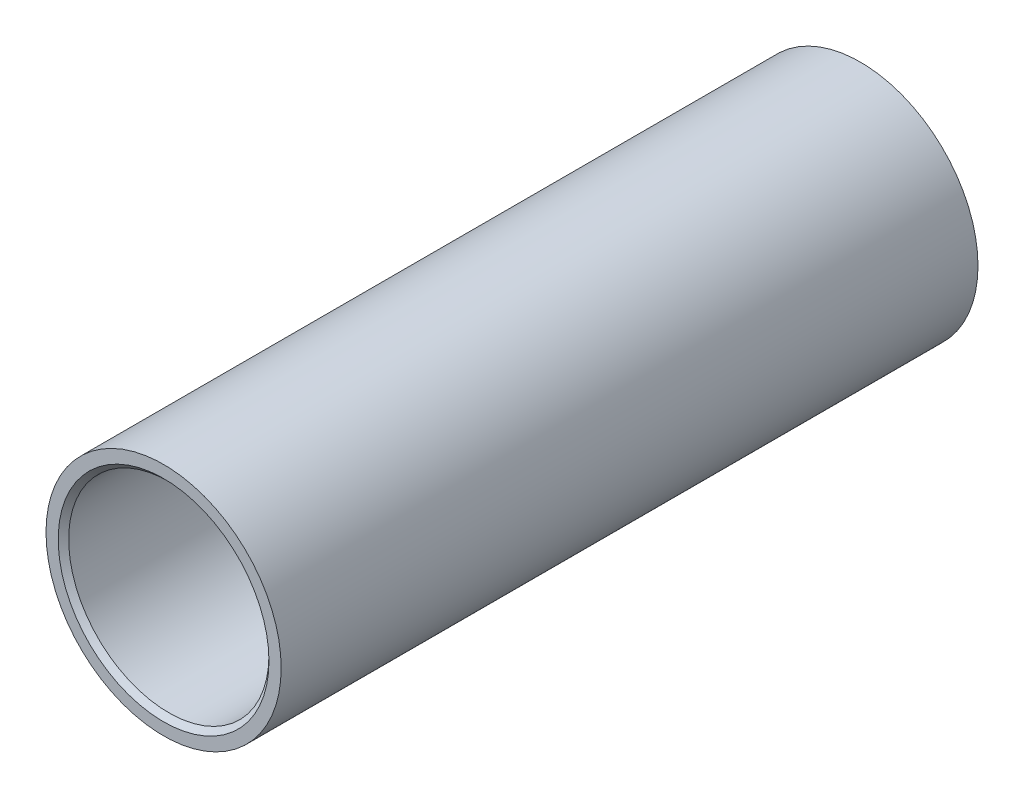
ISO-10303-21;
HEADER;
FILE_DESCRIPTION(('STEP AP214'),'2;1');
FILE_NAME('part.step','',(''),(''),'','','');
FILE_SCHEMA(('AUTOMOTIVE_DESIGN { 1 0 10303 214 1 1 1 1 }'));
ENDSEC;
DATA;
#1=APPLICATION_CONTEXT('core data for automotive mechanical design processes');
#2=APPLICATION_PROTOCOL_DEFINITION('international standard','automotive_design',2000,#1);
#3=PRODUCT_CONTEXT('',#1,'mechanical');
#4=PRODUCT('Part','Part','',(#3));
#5=PRODUCT_RELATED_PRODUCT_CATEGORY('part','',(#4));
#6=PRODUCT_DEFINITION_FORMATION('','',#4);
#7=PRODUCT_DEFINITION_CONTEXT('part definition',#1,'design');
#8=PRODUCT_DEFINITION('design','',#6,#7);
#9=PRODUCT_DEFINITION_SHAPE('','',#8);
#10=(LENGTH_UNIT() NAMED_UNIT(*) SI_UNIT(.MILLI.,.METRE.));
#11=(NAMED_UNIT(*) PLANE_ANGLE_UNIT() SI_UNIT($,.RADIAN.));
#12=(NAMED_UNIT(*) SI_UNIT($,.STERADIAN.) SOLID_ANGLE_UNIT());
#13=UNCERTAINTY_MEASURE_WITH_UNIT(LENGTH_MEASURE(1.E-05),#10,'distance_accuracy_value','');
#14=(GEOMETRIC_REPRESENTATION_CONTEXT(3) GLOBAL_UNCERTAINTY_ASSIGNED_CONTEXT((#13)) GLOBAL_UNIT_ASSIGNED_CONTEXT((#10,
#11,#12)) REPRESENTATION_CONTEXT('',''));
#15=CARTESIAN_POINT('',(0.,0.,0.));
#16=DIRECTION('',(0.,0.,1.));
#17=DIRECTION('',(1.,0.,0.));
#18=AXIS2_PLACEMENT_3D('',#15,#16,#17);
#19=CARTESIAN_POINT('',(0.,0.,101.6));
#20=DIRECTION('',(0.,0.,-1.));
#21=DIRECTION('',(-1.,0.,0.));
#22=AXIS2_PLACEMENT_3D('',#19,#20,#21);
#23=CYLINDRICAL_SURFACE('',#22,14.605);
#24=CARTESIAN_POINT('',(0.,0.,74.422));
#25=DIRECTION('',(0.,0.,1.));
#26=DIRECTION('',(1.,0.,0.));
#27=AXIS2_PLACEMENT_3D('',#24,#25,#26);
#28=CIRCLE('',#27,14.605);
#29=CARTESIAN_POINT('',(14.605,0.,74.422));
#30=VERTEX_POINT('',#29);
#31=EDGE_CURVE('E49',#30,#30,#28,.F.);
#32=ORIENTED_EDGE('',*,*,#31,.T.);
#33=EDGE_LOOP('',(#32));
#34=FACE_BOUND('',#33,.T.);
#35=CARTESIAN_POINT('',(0.,0.,100.838));
#36=DIRECTION('',(0.,0.,1.));
#37=DIRECTION('',(1.,0.,0.));
#38=AXIS2_PLACEMENT_3D('',#35,#36,#37);
#39=CIRCLE('',#38,14.605);
#40=CARTESIAN_POINT('',(14.605,0.,100.838));
#41=VERTEX_POINT('',#40);
#42=EDGE_CURVE('E68',#41,#41,#39,.T.);
#43=ORIENTED_EDGE('',*,*,#42,.T.);
#44=EDGE_LOOP('',(#43));
#45=FACE_BOUND('',#44,.T.);
#46=ADVANCED_FACE('F41',(#34,#45),#23,.F.);
#47=CARTESIAN_POINT('',(0.,0.,27.178));
#48=DIRECTION('',(0.,0.,-1.));
#49=DIRECTION('',(-1.,0.,0.));
#50=AXIS2_PLACEMENT_3D('',#47,#48,#49);
#51=CIRCLE('',#50,14.605);
#52=CARTESIAN_POINT('',(-14.605,0.,27.178));
#53=VERTEX_POINT('',#52);
#54=EDGE_CURVE('E10',#53,#53,#51,.F.);
#55=ORIENTED_EDGE('',*,*,#54,.T.);
#56=EDGE_LOOP('',(#55));
#57=FACE_BOUND('',#56,.T.);
#58=CARTESIAN_POINT('',(0.,0.,0.762000000000013));
#59=DIRECTION('',(0.,0.,1.));
#60=DIRECTION('',(1.,0.,0.));
#61=AXIS2_PLACEMENT_3D('',#58,#59,#60);
#62=CIRCLE('',#61,14.605);
#63=CARTESIAN_POINT('',(-14.605,0.,0.762000000000013));
#64=VERTEX_POINT('',#63);
#65=EDGE_CURVE('E65',#64,#64,#62,.F.);
#66=ORIENTED_EDGE('',*,*,#65,.T.);
#67=EDGE_LOOP('',(#66));
#68=FACE_BOUND('',#67,.T.);
#69=ADVANCED_FACE('F86',(#57,#68),#23,.F.);
#70=CARTESIAN_POINT('',(0.,0.,101.6));
#71=DIRECTION('',(0.,0.,-1.));
#72=DIRECTION('',(-1.,0.,0.));
#73=AXIS2_PLACEMENT_3D('',#70,#71,#72);
#74=CYLINDRICAL_SURFACE('',#73,17.145);
#75=CARTESIAN_POINT('',(0.,0.,101.6));
#76=DIRECTION('',(0.,0.,1.));
#77=DIRECTION('',(1.,0.,0.));
#78=AXIS2_PLACEMENT_3D('',#75,#76,#77);
#79=CIRCLE('',#78,17.145);
#80=CARTESIAN_POINT('',(17.145,0.,101.6));
#81=VERTEX_POINT('',#80);
#82=EDGE_CURVE('E74',#81,#81,#79,.T.);
#83=ORIENTED_EDGE('',*,*,#82,.F.);
#84=EDGE_LOOP('',(#83));
#85=FACE_BOUND('',#84,.T.);
#86=CARTESIAN_POINT('',(0.,0.,0.));
#87=DIRECTION('',(0.,0.,1.));
#88=DIRECTION('',(1.,0.,0.));
#89=AXIS2_PLACEMENT_3D('',#86,#87,#88);
#90=CIRCLE('',#89,17.145);
#91=CARTESIAN_POINT('',(17.145,0.,0.));
#92=VERTEX_POINT('',#91);
#93=EDGE_CURVE('E75',#92,#92,#90,.T.);
#94=ORIENTED_EDGE('',*,*,#93,.T.);
#95=EDGE_LOOP('',(#94));
#96=FACE_BOUND('',#95,.T.);
#97=ADVANCED_FACE('F83',(#85,#96),#74,.T.);
#98=CARTESIAN_POINT('',(0.,0.,101.6));
#99=DIRECTION('',(0.,0.,1.));
#100=DIRECTION('',(1.,0.,0.));
#101=AXIS2_PLACEMENT_3D('',#98,#99,#100);
#102=PLANE('',#101);
#103=CARTESIAN_POINT('',(0.,0.,101.6));
#104=DIRECTION('',(0.,0.,1.));
#105=DIRECTION('',(1.,0.,0.));
#106=AXIS2_PLACEMENT_3D('',#103,#104,#105);
#107=CIRCLE('',#106,15.367);
#108=CARTESIAN_POINT('',(15.367,0.,101.6));
#109=VERTEX_POINT('',#108);
#110=EDGE_CURVE('E62',#109,#109,#107,.F.);
#111=ORIENTED_EDGE('',*,*,#110,.T.);
#112=EDGE_LOOP('',(#111));
#113=FACE_BOUND('',#112,.T.);
#114=ORIENTED_EDGE('',*,*,#82,.T.);
#115=EDGE_LOOP('',(#114));
#116=FACE_BOUND('',#115,.T.);
#117=ADVANCED_FACE('F81',(#113,#116),#102,.T.);
#118=CARTESIAN_POINT('',(0.,0.,0.));
#119=DIRECTION('',(0.,0.,1.));
#120=DIRECTION('',(1.,0.,0.));
#121=AXIS2_PLACEMENT_3D('',#118,#119,#120);
#122=PLANE('',#121);
#123=CARTESIAN_POINT('',(0.,0.,0.));
#124=DIRECTION('',(0.,0.,1.));
#125=DIRECTION('',(1.,0.,0.));
#126=AXIS2_PLACEMENT_3D('',#123,#124,#125);
#127=CIRCLE('',#126,15.367);
#128=CARTESIAN_POINT('',(-15.367,0.,0.));
#129=VERTEX_POINT('',#128);
#130=EDGE_CURVE('E71',#129,#129,#127,.T.);
#131=ORIENTED_EDGE('',*,*,#130,.T.);
#132=EDGE_LOOP('',(#131));
#133=FACE_BOUND('',#132,.T.);
#134=ORIENTED_EDGE('',*,*,#93,.F.);
#135=EDGE_LOOP('',(#134));
#136=FACE_BOUND('',#135,.T.);
#137=ADVANCED_FACE('F90',(#133,#136),#122,.F.);
#138=CARTESIAN_POINT('',(0.,0.,0.));
#139=DIRECTION('',(0.,0.,-1.));
#140=DIRECTION('',(-1.,0.,0.));
#141=AXIS2_PLACEMENT_3D('',#138,#139,#140);
#142=CONICAL_SURFACE('',#141,15.367,0.785398163397443);
#143=CARTESIAN_POINT('',(-14.605,0.,0.762000000000013));
#144=CARTESIAN_POINT('',(-14.6129375,0.,0.754062500000012));
#145=CARTESIAN_POINT('',(-14.620875,0.,0.746125000000012));
#146=CARTESIAN_POINT('',(-14.63675,0.,0.730250000000012));
#147=CARTESIAN_POINT('',(-14.6446875,0.,0.722312500000012));
#148=CARTESIAN_POINT('',(-14.6605625,0.,0.706437500000012));
#149=CARTESIAN_POINT('',(-14.6685,0.,0.698500000000012));
#150=CARTESIAN_POINT('',(-14.684375,0.,0.682625000000011));
#151=CARTESIAN_POINT('',(-14.6923125,0.,0.674687500000011));
#152=CARTESIAN_POINT('',(-14.7081875,0.,0.658812500000011));
#153=CARTESIAN_POINT('',(-14.716125,0.,0.650875000000011));
#154=CARTESIAN_POINT('',(-14.732,0.,0.635000000000011));
#155=CARTESIAN_POINT('',(-14.7399375,0.,0.62706250000001));
#156=CARTESIAN_POINT('',(-14.7558125,0.,0.61118750000001));
#157=CARTESIAN_POINT('',(-14.76375,0.,0.60325000000001));
#158=CARTESIAN_POINT('',(-14.779625,0.,0.58737500000001));
#159=CARTESIAN_POINT('',(-14.7875625,0.,0.57943750000001));
#160=CARTESIAN_POINT('',(-14.8034375,0.,0.56356250000001));
#161=CARTESIAN_POINT('',(-14.811375,0.,0.555625000000009));
#162=CARTESIAN_POINT('',(-14.82725,0.,0.539750000000009));
#163=CARTESIAN_POINT('',(-14.8351875,0.,0.531812500000009));
#164=CARTESIAN_POINT('',(-14.8510625,0.,0.515937500000008));
#165=CARTESIAN_POINT('',(-14.859,0.,0.508000000000008));
#166=CARTESIAN_POINT('',(-14.874875,0.,0.492125000000008));
#167=CARTESIAN_POINT('',(-14.8828125,0.,0.484187500000008));
#168=CARTESIAN_POINT('',(-14.8986875,0.,0.468312500000008));
#169=CARTESIAN_POINT('',(-14.906625,0.,0.460375000000007));
#170=CARTESIAN_POINT('',(-14.9225,0.,0.444500000000007));
#171=CARTESIAN_POINT('',(-14.9304375,0.,0.436562500000007));
#172=CARTESIAN_POINT('',(-14.9463125,0.,0.420687500000007));
#173=CARTESIAN_POINT('',(-14.95425,0.,0.412750000000007));
#174=CARTESIAN_POINT('',(-14.970125,0.,0.396875000000006));
#175=CARTESIAN_POINT('',(-14.9780625,0.,0.388937500000006));
#176=CARTESIAN_POINT('',(-14.9939375,0.,0.373062500000006));
#177=CARTESIAN_POINT('',(-15.001875,0.,0.365125000000006));
#178=CARTESIAN_POINT('',(-15.01775,0.,0.349250000000006));
#179=CARTESIAN_POINT('',(-15.0256875,0.,0.341312500000005));
#180=CARTESIAN_POINT('',(-15.0415625,0.,0.325437500000005));
#181=CARTESIAN_POINT('',(-15.0495,0.,0.317500000000005));
#182=CARTESIAN_POINT('',(-15.065375,0.,0.301625000000005));
#183=CARTESIAN_POINT('',(-15.0733125,0.,0.293687500000005));
#184=CARTESIAN_POINT('',(-15.0891875,0.,0.277812500000004));
#185=CARTESIAN_POINT('',(-15.097125,0.,0.269875000000004));
#186=CARTESIAN_POINT('',(-15.113,0.,0.254000000000004));
#187=CARTESIAN_POINT('',(-15.1209375,0.,0.246062500000004));
#188=CARTESIAN_POINT('',(-15.1368125,0.,0.230187500000004));
#189=CARTESIAN_POINT('',(-15.14475,0.,0.222250000000004));
#190=CARTESIAN_POINT('',(-15.160625,0.,0.206375000000003));
#191=CARTESIAN_POINT('',(-15.1685625,0.,0.198437500000003));
#192=CARTESIAN_POINT('',(-15.1844375,0.,0.182562500000003));
#193=CARTESIAN_POINT('',(-15.192375,0.,0.174625000000003));
#194=CARTESIAN_POINT('',(-15.20825,0.,0.158750000000003));
#195=CARTESIAN_POINT('',(-15.2161875,0.,0.150812500000003));
#196=CARTESIAN_POINT('',(-15.2320625,0.,0.134937500000002));
#197=CARTESIAN_POINT('',(-15.24,0.,0.127000000000002));
#198=CARTESIAN_POINT('',(-15.255875,0.,0.111125000000002));
#199=CARTESIAN_POINT('',(-15.2638125,0.,0.103187500000002));
#200=CARTESIAN_POINT('',(-15.2796875,0.,0.0873125000000016));
#201=CARTESIAN_POINT('',(-15.287625,0.,0.0793750000000014));
#202=CARTESIAN_POINT('',(-15.3035,0.,0.0635000000000009));
#203=CARTESIAN_POINT('',(-15.3114375,0.,0.0555625000000008));
#204=CARTESIAN_POINT('',(-15.3273125,0.,0.0396875000000005));
#205=CARTESIAN_POINT('',(-15.33525,0.,0.0317500000000005));
#206=CARTESIAN_POINT('',(-15.351125,0.,0.0158750000000005));
#207=CARTESIAN_POINT('',(-15.3590625,0.,0.00793750000000056));
#208=CARTESIAN_POINT('',(-15.367,0.,0.));
#209=B_SPLINE_CURVE_WITH_KNOTS('',3,(#143,#144,#145,#146,#147,#148,#149,#150,#151,#152,#153,
#154,#155,#156,#157,#158,#159,#160,#161,#162,#163,#164,#165,#166,#167,#168,#169,#170,#171,#172,
#173,#174,#175,#176,#177,#178,#179,#180,#181,#182,#183,#184,#185,#186,#187,#188,#189,#190,#191,
#192,#193,#194,#195,#196,#197,#198,#199,#200,#201,#202,#203,#204,#205,#206,#207,#208),
.UNSPECIFIED.,.F.,.F.,(4,2,2,2,2,2,2,2,2,2,2,2,2,2,2,2,2,2,2,2,2,2,2,2,2,2,2,2,2,2,2,2,4),(0.,
0.0336759604540093,0.0673519209080198,0.101027881362029,0.134703841816038,0.168379802270049,
0.202055762724058,0.235731723178067,0.269407683632078,0.303083644086087,0.336759604540096,
0.370435564994107,0.404111525448116,0.437787485902125,0.471463446356136,0.505139406810145,
0.538815367264156,0.572491327718165,0.606167288172174,0.639843248626185,0.673519209080194,
0.707195169534203,0.740871129988214,0.774547090442223,0.808223050896232,0.841899011350243,
0.875574971804252,0.909250932258261,0.942926892712272,0.976602853166281,1.01027881362029,
1.0439547740743,1.07763073452831),.UNSPECIFIED.);
#210=EDGE_CURVE('BSEAM92',#64,#129,#209,.T.);
#211=ORIENTED_EDGE('',*,*,#65,.F.);
#212=ORIENTED_EDGE('',*,*,#130,.F.);
#213=ORIENTED_EDGE('',*,*,#210,.T.);
#214=ORIENTED_EDGE('',*,*,#210,.F.);
#215=EDGE_LOOP('',(#211,#213,#212,#214));
#216=FACE_BOUND('',#215,.T.);
#217=ADVANCED_FACE('F92',(#216),#142,.F.);
#218=CARTESIAN_POINT('',(0.,0.,100.838));
#219=DIRECTION('',(0.,0.,1.));
#220=DIRECTION('',(1.,0.,0.));
#221=AXIS2_PLACEMENT_3D('',#218,#219,#220);
#222=CONICAL_SURFACE('',#221,14.605,0.785398163397435);
#223=ORIENTED_EDGE('',*,*,#110,.F.);
#224=EDGE_LOOP('',(#223));
#225=FACE_BOUND('',#224,.T.);
#226=ORIENTED_EDGE('',*,*,#42,.F.);
#227=EDGE_LOOP('',(#226));
#228=FACE_BOUND('',#227,.T.);
#229=ADVANCED_FACE('F99',(#225,#228),#222,.F.);
#230=CARTESIAN_POINT('',(0.,0.,76.2));
#231=DIRECTION('',(0.,0.,-1.));
#232=DIRECTION('',(-1.,0.,0.));
#233=AXIS2_PLACEMENT_3D('',#230,#231,#232);
#234=CYLINDRICAL_SURFACE('',#233,13.843);
#235=CARTESIAN_POINT('',(0.,0.,73.66));
#236=DIRECTION('',(0.,0.,-1.));
#237=DIRECTION('',(-1.,0.,0.));
#238=AXIS2_PLACEMENT_3D('',#235,#236,#237);
#239=CIRCLE('',#238,13.843);
#240=CARTESIAN_POINT('',(-13.843,0.,73.66));
#241=VERTEX_POINT('',#240);
#242=EDGE_CURVE('E53',#241,#241,#239,.F.);
#243=ORIENTED_EDGE('',*,*,#242,.T.);
#244=EDGE_LOOP('',(#243));
#245=FACE_BOUND('',#244,.T.);
#246=CARTESIAN_POINT('',(0.,0.,27.94));
#247=DIRECTION('',(0.,0.,-1.));
#248=DIRECTION('',(-1.,0.,0.));
#249=AXIS2_PLACEMENT_3D('',#246,#247,#248);
#250=CIRCLE('',#249,13.843);
#251=CARTESIAN_POINT('',(-13.843,0.,27.94));
#252=VERTEX_POINT('',#251);
#253=EDGE_CURVE('E57',#252,#252,#250,.T.);
#254=ORIENTED_EDGE('',*,*,#253,.T.);
#255=EDGE_LOOP('',(#254));
#256=FACE_BOUND('',#255,.T.);
#257=ADVANCED_FACE('F119',(#245,#256),#234,.F.);
#258=CARTESIAN_POINT('',(0.,0.,76.2));
#259=DIRECTION('',(0.,0.,1.));
#260=DIRECTION('',(1.,0.,0.));
#261=AXIS2_PLACEMENT_3D('',#258,#259,#260);
#262=CONICAL_SURFACE('',#261,16.383,0.785398163397454);
#263=ORIENTED_EDGE('',*,*,#242,.F.);
#264=EDGE_LOOP('',(#263));
#265=FACE_BOUND('',#264,.T.);
#266=ORIENTED_EDGE('',*,*,#31,.F.);
#267=EDGE_LOOP('',(#266));
#268=FACE_BOUND('',#267,.T.);
#269=ADVANCED_FACE('F121',(#265,#268),#262,.F.);
#270=CARTESIAN_POINT('',(0.,0.,27.94));
#271=DIRECTION('',(0.,0.,-1.));
#272=DIRECTION('',(-1.,0.,0.));
#273=AXIS2_PLACEMENT_3D('',#270,#271,#272);
#274=CONICAL_SURFACE('',#273,13.843,0.785398163397442);
#275=ORIENTED_EDGE('',*,*,#54,.F.);
#276=EDGE_LOOP('',(#275));
#277=FACE_BOUND('',#276,.T.);
#278=ORIENTED_EDGE('',*,*,#253,.F.);
#279=EDGE_LOOP('',(#278));
#280=FACE_BOUND('',#279,.T.);
#281=ADVANCED_FACE('F44',(#277,#280),#274,.F.);
#282=CLOSED_SHELL('',(#46,#69,#97,#117,#137,#217,#229,#257,#269,#281));
#283=MANIFOLD_SOLID_BREP('B2',#282);
#284=ADVANCED_BREP_SHAPE_REPRESENTATION('',(#18,#283),#14);
#285=SHAPE_DEFINITION_REPRESENTATION(#9,#284);
ENDSEC;
END-ISO-10303-21;
